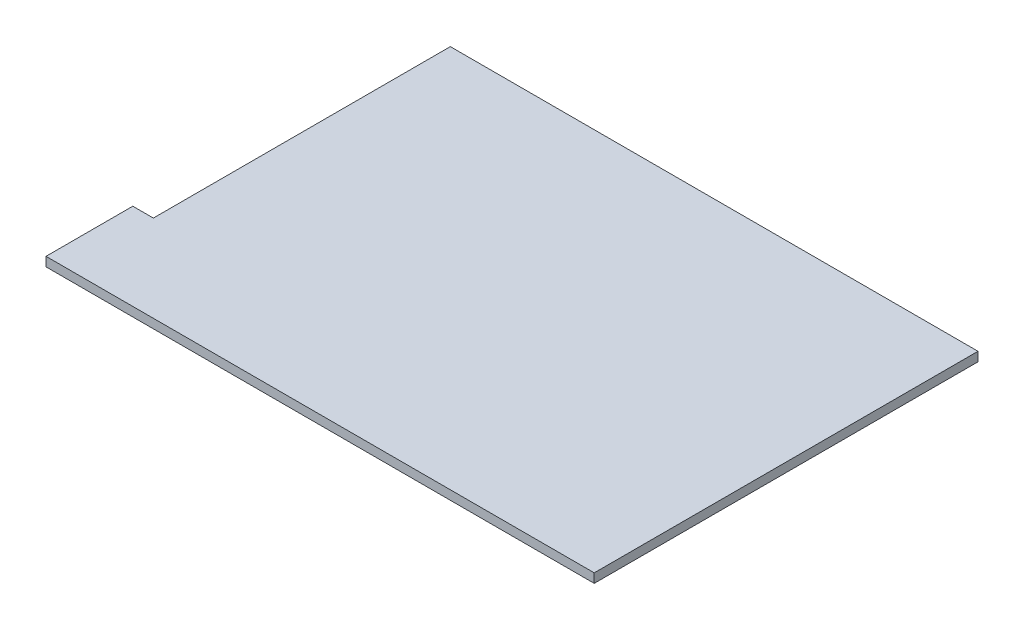
ISO-10303-21;
HEADER;
FILE_DESCRIPTION(('STEP AP214'),'2;1');
FILE_NAME('part.step','',(''),(''),'','','');
FILE_SCHEMA(('AUTOMOTIVE_DESIGN { 1 0 10303 214 1 1 1 1 }'));
ENDSEC;
DATA;
#1=APPLICATION_CONTEXT('core data for automotive mechanical design processes');
#2=APPLICATION_PROTOCOL_DEFINITION('international standard','automotive_design',2000,#1);
#3=PRODUCT_CONTEXT('',#1,'mechanical');
#4=PRODUCT('Part','Part','',(#3));
#5=PRODUCT_RELATED_PRODUCT_CATEGORY('part','',(#4));
#6=PRODUCT_DEFINITION_FORMATION('','',#4);
#7=PRODUCT_DEFINITION_CONTEXT('part definition',#1,'design');
#8=PRODUCT_DEFINITION('design','',#6,#7);
#9=PRODUCT_DEFINITION_SHAPE('','',#8);
#10=(LENGTH_UNIT() NAMED_UNIT(*) SI_UNIT(.MILLI.,.METRE.));
#11=(NAMED_UNIT(*) PLANE_ANGLE_UNIT() SI_UNIT($,.RADIAN.));
#12=(NAMED_UNIT(*) SI_UNIT($,.STERADIAN.) SOLID_ANGLE_UNIT());
#13=UNCERTAINTY_MEASURE_WITH_UNIT(LENGTH_MEASURE(1.E-05),#10,'distance_accuracy_value','');
#14=(GEOMETRIC_REPRESENTATION_CONTEXT(3) GLOBAL_UNCERTAINTY_ASSIGNED_CONTEXT((#13)) GLOBAL_UNIT_ASSIGNED_CONTEXT((#10,
#11,#12)) REPRESENTATION_CONTEXT('',''));
#15=CARTESIAN_POINT('',(0.,0.,0.));
#16=DIRECTION('',(0.,0.,1.));
#17=DIRECTION('',(1.,0.,0.));
#18=AXIS2_PLACEMENT_3D('',#15,#16,#17);
#19=CARTESIAN_POINT('',(762.000000000003,12.7,-533.4));
#20=DIRECTION('',(-1.,0.,0.));
#21=DIRECTION('',(0.,0.,1.));
#22=AXIS2_PLACEMENT_3D('',#19,#20,#21);
#23=PLANE('',#22);
#24=DIRECTION('',(0.,0.,-1.));
#25=VECTOR('',#24,1.);
#26=CARTESIAN_POINT('',(762.000000000003,0.,-533.4));
#27=LINE('',#26,#25);
#28=CARTESIAN_POINT('',(762.000000000002,0.,0.));
#29=VERTEX_POINT('',#28);
#30=CARTESIAN_POINT('',(762.000000000003,0.,-533.4));
#31=VERTEX_POINT('',#30);
#32=EDGE_CURVE('E118',#29,#31,#27,.T.);
#33=ORIENTED_EDGE('',*,*,#32,.T.);
#34=DIRECTION('',(0.,-1.,0.));
#35=VECTOR('',#34,1.);
#36=CARTESIAN_POINT('',(762.000000000003,12.7,-533.4));
#37=LINE('',#36,#35);
#38=CARTESIAN_POINT('',(762.000000000003,12.7,-533.4));
#39=VERTEX_POINT('',#38);
#40=EDGE_CURVE('E11',#39,#31,#37,.T.);
#41=ORIENTED_EDGE('',*,*,#40,.F.);
#42=DIRECTION('',(0.,0.,-1.));
#43=VECTOR('',#42,1.);
#44=CARTESIAN_POINT('',(762.000000000003,12.7,-533.4));
#45=LINE('',#44,#43);
#46=CARTESIAN_POINT('',(762.000000000002,12.7,0.));
#47=VERTEX_POINT('',#46);
#48=EDGE_CURVE('E109',#47,#39,#45,.T.);
#49=ORIENTED_EDGE('',*,*,#48,.F.);
#50=DIRECTION('',(0.,-1.,0.));
#51=VECTOR('',#50,1.);
#52=CARTESIAN_POINT('',(762.000000000002,12.7,0.));
#53=LINE('',#52,#51);
#54=EDGE_CURVE('E117',#47,#29,#53,.T.);
#55=ORIENTED_EDGE('',*,*,#54,.T.);
#56=EDGE_LOOP('',(#33,#41,#49,#55));
#57=FACE_BOUND('',#56,.T.);
#58=ADVANCED_FACE('F35',(#57),#23,.F.);
#59=CARTESIAN_POINT('',(0.,12.7,-533.4));
#60=DIRECTION('',(0.,0.,1.));
#61=DIRECTION('',(1.,0.,0.));
#62=AXIS2_PLACEMENT_3D('',#59,#60,#61);
#63=PLANE('',#62);
#64=DIRECTION('',(-1.,0.,0.));
#65=VECTOR('',#64,1.);
#66=CARTESIAN_POINT('',(0.,0.,-533.4));
#67=LINE('',#66,#65);
#68=CARTESIAN_POINT('',(28.575,0.,-533.4));
#69=VERTEX_POINT('',#68);
#70=EDGE_CURVE('E105',#31,#69,#67,.T.);
#71=ORIENTED_EDGE('',*,*,#70,.T.);
#72=DIRECTION('',(0.,-1.,0.));
#73=VECTOR('',#72,1.);
#74=CARTESIAN_POINT('',(28.575,12.7,-533.4));
#75=LINE('',#74,#73);
#76=CARTESIAN_POINT('',(28.575,12.7,-533.4));
#77=VERTEX_POINT('',#76);
#78=EDGE_CURVE('E49',#77,#69,#75,.T.);
#79=ORIENTED_EDGE('',*,*,#78,.F.);
#80=DIRECTION('',(-1.,0.,0.));
#81=VECTOR('',#80,1.);
#82=CARTESIAN_POINT('',(0.,12.7,-533.4));
#83=LINE('',#82,#81);
#84=EDGE_CURVE('E80',#39,#77,#83,.T.);
#85=ORIENTED_EDGE('',*,*,#84,.F.);
#86=ORIENTED_EDGE('',*,*,#40,.T.);
#87=EDGE_LOOP('',(#71,#79,#85,#86));
#88=FACE_BOUND('',#87,.T.);
#89=ADVANCED_FACE('F104',(#88),#63,.F.);
#90=CARTESIAN_POINT('',(0.,12.7,-533.4));
#91=DIRECTION('',(1.,0.,0.));
#92=DIRECTION('',(0.,0.,-1.));
#93=AXIS2_PLACEMENT_3D('',#90,#91,#92);
#94=PLANE('',#93);
#95=DIRECTION('',(0.,0.,1.));
#96=VECTOR('',#95,1.);
#97=CARTESIAN_POINT('',(0.,12.7,-533.4));
#98=LINE('',#97,#96);
#99=CARTESIAN_POINT('',(0.,12.7,-120.65));
#100=VERTEX_POINT('',#99);
#101=CARTESIAN_POINT('',(0.,12.7,0.));
#102=VERTEX_POINT('',#101);
#103=EDGE_CURVE('E111',#100,#102,#98,.T.);
#104=ORIENTED_EDGE('',*,*,#103,.F.);
#105=DIRECTION('',(0.,-1.,0.));
#106=VECTOR('',#105,1.);
#107=CARTESIAN_POINT('',(0.,12.7,-120.65));
#108=LINE('',#107,#106);
#109=CARTESIAN_POINT('',(0.,0.,-120.65));
#110=VERTEX_POINT('',#109);
#111=EDGE_CURVE('E121',#100,#110,#108,.T.);
#112=ORIENTED_EDGE('',*,*,#111,.T.);
#113=DIRECTION('',(0.,0.,1.));
#114=VECTOR('',#113,1.);
#115=CARTESIAN_POINT('',(0.,0.,-533.4));
#116=LINE('',#115,#114);
#117=CARTESIAN_POINT('',(0.,0.,0.));
#118=VERTEX_POINT('',#117);
#119=EDGE_CURVE('E123',#110,#118,#116,.T.);
#120=ORIENTED_EDGE('',*,*,#119,.T.);
#121=DIRECTION('',(0.,-1.,0.));
#122=VECTOR('',#121,1.);
#123=CARTESIAN_POINT('',(0.,12.7,0.));
#124=LINE('',#123,#122);
#125=EDGE_CURVE('E42',#102,#118,#124,.T.);
#126=ORIENTED_EDGE('',*,*,#125,.F.);
#127=EDGE_LOOP('',(#104,#112,#120,#126));
#128=FACE_BOUND('',#127,.T.);
#129=ADVANCED_FACE('F140',(#128),#94,.F.);
#130=CARTESIAN_POINT('',(0.,12.7,0.));
#131=DIRECTION('',(0.,0.,-1.));
#132=DIRECTION('',(-1.,0.,0.));
#133=AXIS2_PLACEMENT_3D('',#130,#131,#132);
#134=PLANE('',#133);
#135=DIRECTION('',(1.,0.,0.));
#136=VECTOR('',#135,1.);
#137=CARTESIAN_POINT('',(0.,0.,0.));
#138=LINE('',#137,#136);
#139=EDGE_CURVE('E75',#118,#29,#138,.T.);
#140=ORIENTED_EDGE('',*,*,#139,.T.);
#141=ORIENTED_EDGE('',*,*,#54,.F.);
#142=DIRECTION('',(1.,0.,0.));
#143=VECTOR('',#142,1.);
#144=CARTESIAN_POINT('',(0.,12.7,0.));
#145=LINE('',#144,#143);
#146=EDGE_CURVE('E58',#102,#47,#145,.T.);
#147=ORIENTED_EDGE('',*,*,#146,.F.);
#148=ORIENTED_EDGE('',*,*,#125,.T.);
#149=EDGE_LOOP('',(#140,#141,#147,#148));
#150=FACE_BOUND('',#149,.T.);
#151=ADVANCED_FACE('F127',(#150),#134,.F.);
#152=CARTESIAN_POINT('',(0.,12.7,0.));
#153=DIRECTION('',(0.,1.,0.));
#154=DIRECTION('',(0.,0.,1.));
#155=AXIS2_PLACEMENT_3D('',#152,#153,#154);
#156=PLANE('',#155);
#157=DIRECTION('',(-1.,0.,0.));
#158=VECTOR('',#157,1.);
#159=CARTESIAN_POINT('',(0.,12.7,-120.65));
#160=LINE('',#159,#158);
#161=CARTESIAN_POINT('',(28.575,12.7,-120.65));
#162=VERTEX_POINT('',#161);
#163=EDGE_CURVE('E100',#162,#100,#160,.T.);
#164=ORIENTED_EDGE('',*,*,#163,.T.);
#165=ORIENTED_EDGE('',*,*,#103,.T.);
#166=ORIENTED_EDGE('',*,*,#146,.T.);
#167=ORIENTED_EDGE('',*,*,#48,.T.);
#168=ORIENTED_EDGE('',*,*,#84,.T.);
#169=DIRECTION('',(0.,0.,1.));
#170=VECTOR('',#169,1.);
#171=CARTESIAN_POINT('',(28.575,12.7,-533.4));
#172=LINE('',#171,#170);
#173=EDGE_CURVE('E95',#77,#162,#172,.T.);
#174=ORIENTED_EDGE('',*,*,#173,.T.);
#175=EDGE_LOOP('',(#164,#165,#166,#167,#168,#174));
#176=FACE_BOUND('',#175,.T.);
#177=ADVANCED_FACE('F107',(#176),#156,.T.);
#178=CARTESIAN_POINT('',(0.,0.,0.));
#179=DIRECTION('',(0.,1.,0.));
#180=DIRECTION('',(0.,0.,1.));
#181=AXIS2_PLACEMENT_3D('',#178,#179,#180);
#182=PLANE('',#181);
#183=ORIENTED_EDGE('',*,*,#119,.F.);
#184=DIRECTION('',(-1.,0.,0.));
#185=VECTOR('',#184,1.);
#186=CARTESIAN_POINT('',(0.,0.,-120.65));
#187=LINE('',#186,#185);
#188=CARTESIAN_POINT('',(28.575,0.,-120.65));
#189=VERTEX_POINT('',#188);
#190=EDGE_CURVE('E101',#189,#110,#187,.T.);
#191=ORIENTED_EDGE('',*,*,#190,.F.);
#192=DIRECTION('',(0.,0.,1.));
#193=VECTOR('',#192,1.);
#194=CARTESIAN_POINT('',(28.575,0.,-533.4));
#195=LINE('',#194,#193);
#196=EDGE_CURVE('E160',#69,#189,#195,.T.);
#197=ORIENTED_EDGE('',*,*,#196,.F.);
#198=ORIENTED_EDGE('',*,*,#70,.F.);
#199=ORIENTED_EDGE('',*,*,#32,.F.);
#200=ORIENTED_EDGE('',*,*,#139,.F.);
#201=EDGE_LOOP('',(#183,#191,#197,#198,#199,#200));
#202=FACE_BOUND('',#201,.T.);
#203=ADVANCED_FACE('F133',(#202),#182,.F.);
#204=CARTESIAN_POINT('',(0.,12.7,-120.65));
#205=DIRECTION('',(0.,0.,1.));
#206=DIRECTION('',(1.,0.,0.));
#207=AXIS2_PLACEMENT_3D('',#204,#205,#206);
#208=PLANE('',#207);
#209=ORIENTED_EDGE('',*,*,#190,.T.);
#210=ORIENTED_EDGE('',*,*,#111,.F.);
#211=ORIENTED_EDGE('',*,*,#163,.F.);
#212=DIRECTION('',(0.,-1.,0.));
#213=VECTOR('',#212,1.);
#214=CARTESIAN_POINT('',(28.575,12.7,-120.65));
#215=LINE('',#214,#213);
#216=EDGE_CURVE('E97',#162,#189,#215,.T.);
#217=ORIENTED_EDGE('',*,*,#216,.T.);
#218=EDGE_LOOP('',(#209,#210,#211,#217));
#219=FACE_BOUND('',#218,.T.);
#220=ADVANCED_FACE('F150',(#219),#208,.F.);
#221=CARTESIAN_POINT('',(28.575,12.7,-533.4));
#222=DIRECTION('',(1.,0.,0.));
#223=DIRECTION('',(0.,0.,-1.));
#224=AXIS2_PLACEMENT_3D('',#221,#222,#223);
#225=PLANE('',#224);
#226=ORIENTED_EDGE('',*,*,#196,.T.);
#227=ORIENTED_EDGE('',*,*,#216,.F.);
#228=ORIENTED_EDGE('',*,*,#173,.F.);
#229=ORIENTED_EDGE('',*,*,#78,.T.);
#230=EDGE_LOOP('',(#226,#227,#228,#229));
#231=FACE_BOUND('',#230,.T.);
#232=ADVANCED_FACE('F96',(#231),#225,.F.);
#233=CLOSED_SHELL('',(#58,#89,#129,#151,#177,#203,#220,#232));
#234=MANIFOLD_SOLID_BREP('B2',#233);
#235=ADVANCED_BREP_SHAPE_REPRESENTATION('',(#18,#234),#14);
#236=SHAPE_DEFINITION_REPRESENTATION(#9,#235);
ENDSEC;
END-ISO-10303-21;
